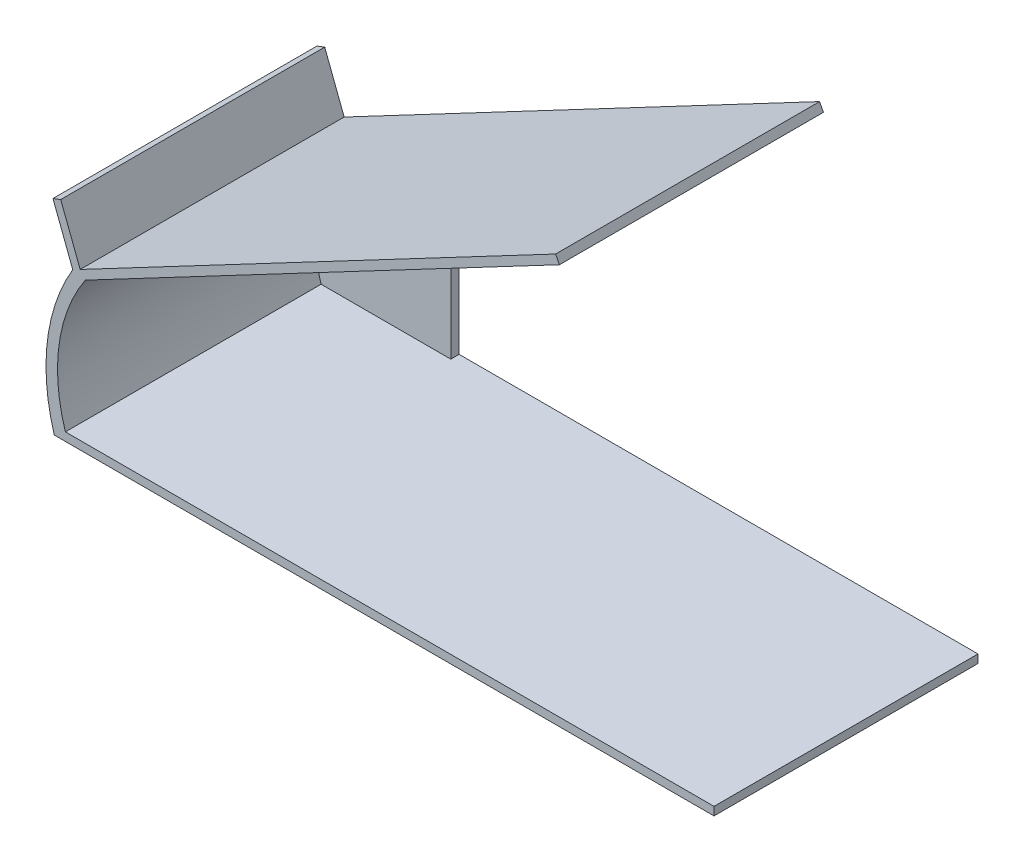
ISO-10303-21;
HEADER;
FILE_DESCRIPTION(('STEP AP214'),'2;1');
FILE_NAME('part.step','',(''),(''),'','','');
FILE_SCHEMA(('AUTOMOTIVE_DESIGN { 1 0 10303 214 1 1 1 1 }'));
ENDSEC;
DATA;
#1=APPLICATION_CONTEXT('core data for automotive mechanical design processes');
#2=APPLICATION_PROTOCOL_DEFINITION('international standard','automotive_design',2000,#1);
#3=PRODUCT_CONTEXT('',#1,'mechanical');
#4=PRODUCT('Part','Part','',(#3));
#5=PRODUCT_RELATED_PRODUCT_CATEGORY('part','',(#4));
#6=PRODUCT_DEFINITION_FORMATION('','',#4);
#7=PRODUCT_DEFINITION_CONTEXT('part definition',#1,'design');
#8=PRODUCT_DEFINITION('design','',#6,#7);
#9=PRODUCT_DEFINITION_SHAPE('','',#8);
#10=(LENGTH_UNIT() NAMED_UNIT(*) SI_UNIT(.MILLI.,.METRE.));
#11=(NAMED_UNIT(*) PLANE_ANGLE_UNIT() SI_UNIT($,.RADIAN.));
#12=(NAMED_UNIT(*) SI_UNIT($,.STERADIAN.) SOLID_ANGLE_UNIT());
#13=UNCERTAINTY_MEASURE_WITH_UNIT(LENGTH_MEASURE(1.E-05),#10,'distance_accuracy_value','');
#14=(GEOMETRIC_REPRESENTATION_CONTEXT(3) GLOBAL_UNCERTAINTY_ASSIGNED_CONTEXT((#13)) GLOBAL_UNIT_ASSIGNED_CONTEXT((#10,
#11,#12)) REPRESENTATION_CONTEXT('',''));
#15=CARTESIAN_POINT('',(0.,0.,0.));
#16=DIRECTION('',(0.,0.,1.));
#17=DIRECTION('',(1.,0.,0.));
#18=AXIS2_PLACEMENT_3D('',#15,#16,#17);
#19=CARTESIAN_POINT('',(63.1559092782897,21.097343814176,95.25));
#20=DIRECTION('',(0.,0.,-1.));
#21=DIRECTION('',(-1.,0.,0.));
#22=AXIS2_PLACEMENT_3D('',#19,#20,#21);
#23=CYLINDRICAL_SURFACE('',#22,59.);
#24=CARTESIAN_POINT('',(63.1559092782897,21.097343814176,3.));
#25=DIRECTION('',(0.,0.,-1.));
#26=DIRECTION('',(-1.,0.,0.));
#27=AXIS2_PLACEMENT_3D('',#24,#25,#26);
#28=CIRCLE('',#27,59.);
#29=CARTESIAN_POINT('',(14.1822917284551,54.,3.));
#30=VERTEX_POINT('',#29);
#31=CARTESIAN_POINT('',(6.99999999999996,2.99999999999997,3.));
#32=VERTEX_POINT('',#31);
#33=EDGE_CURVE('E184',#30,#32,#28,.F.);
#34=ORIENTED_EDGE('',*,*,#33,.F.);
#35=DIRECTION('',(0.,0.,-1.));
#36=VECTOR('',#35,1.);
#37=CARTESIAN_POINT('',(14.1822917284551,54.,95.25));
#38=LINE('',#37,#36);
#39=CARTESIAN_POINT('',(14.1822917284551,54.,95.25));
#40=VERTEX_POINT('',#39);
#41=EDGE_CURVE('E232',#40,#30,#38,.T.);
#42=ORIENTED_EDGE('',*,*,#41,.F.);
#43=CARTESIAN_POINT('',(63.1559092782897,21.097343814176,95.25));
#44=DIRECTION('',(0.,0.,-1.));
#45=DIRECTION('',(1.,0.,0.));
#46=AXIS2_PLACEMENT_3D('',#43,#44,#45);
#47=CIRCLE('',#46,59.);
#48=CARTESIAN_POINT('',(6.99999999999996,2.99999999999997,95.25));
#49=VERTEX_POINT('',#48);
#50=EDGE_CURVE('E196',#49,#40,#47,.T.);
#51=ORIENTED_EDGE('',*,*,#50,.F.);
#52=DIRECTION('',(0.,0.,-1.));
#53=VECTOR('',#52,1.);
#54=CARTESIAN_POINT('',(6.99999999999996,2.99999999999997,95.25));
#55=LINE('',#54,#53);
#56=EDGE_CURVE('E47',#49,#32,#55,.T.);
#57=ORIENTED_EDGE('',*,*,#56,.T.);
#58=EDGE_LOOP('',(#34,#42,#51,#57));
#59=FACE_BOUND('',#58,.T.);
#60=ADVANCED_FACE('F39',(#59),#23,.F.);
#61=CARTESIAN_POINT('',(241.,0.,95.25));
#62=DIRECTION('',(-1.,0.,0.));
#63=DIRECTION('',(0.,0.,1.));
#64=AXIS2_PLACEMENT_3D('',#61,#62,#63);
#65=PLANE('',#64);
#66=DIRECTION('',(0.,1.,0.));
#67=VECTOR('',#66,1.);
#68=CARTESIAN_POINT('',(241.,0.,0.));
#69=LINE('',#68,#67);
#70=CARTESIAN_POINT('',(241.,0.,0.));
#71=VERTEX_POINT('',#70);
#72=CARTESIAN_POINT('',(241.,3.,0.));
#73=VERTEX_POINT('',#72);
#74=EDGE_CURVE('E190',#71,#73,#69,.T.);
#75=ORIENTED_EDGE('',*,*,#74,.T.);
#76=DIRECTION('',(0.,0.,-1.));
#77=VECTOR('',#76,1.);
#78=CARTESIAN_POINT('',(241.,3.,95.25));
#79=LINE('',#78,#77);
#80=CARTESIAN_POINT('',(241.,3.,95.25));
#81=VERTEX_POINT('',#80);
#82=EDGE_CURVE('E11',#81,#73,#79,.T.);
#83=ORIENTED_EDGE('',*,*,#82,.F.);
#84=DIRECTION('',(0.,1.,0.));
#85=VECTOR('',#84,1.);
#86=CARTESIAN_POINT('',(241.,0.,95.25));
#87=LINE('',#86,#85);
#88=CARTESIAN_POINT('',(241.,0.,95.25));
#89=VERTEX_POINT('',#88);
#90=EDGE_CURVE('E191',#89,#81,#87,.T.);
#91=ORIENTED_EDGE('',*,*,#90,.F.);
#92=DIRECTION('',(0.,0.,-1.));
#93=VECTOR('',#92,1.);
#94=CARTESIAN_POINT('',(241.,0.,95.25));
#95=LINE('',#94,#93);
#96=EDGE_CURVE('E208',#89,#71,#95,.T.);
#97=ORIENTED_EDGE('',*,*,#96,.T.);
#98=EDGE_LOOP('',(#75,#83,#91,#97));
#99=FACE_BOUND('',#98,.T.);
#100=ADVANCED_FACE('F41',(#99),#65,.F.);
#101=CARTESIAN_POINT('',(241.,3.,95.25));
#102=DIRECTION('',(0.,-1.,0.));
#103=DIRECTION('',(1.,0.,0.));
#104=AXIS2_PLACEMENT_3D('',#101,#102,#103);
#105=PLANE('',#104);
#106=DIRECTION('',(-1.,0.,0.));
#107=VECTOR('',#106,1.);
#108=CARTESIAN_POINT('',(241.,3.,0.));
#109=LINE('',#108,#107);
#110=CARTESIAN_POINT('',(53.8,2.99999999999998,0.));
#111=VERTEX_POINT('',#110);
#112=EDGE_CURVE('E211',#73,#111,#109,.T.);
#113=ORIENTED_EDGE('',*,*,#112,.T.);
#114=DIRECTION('',(0.,0.,1.));
#115=VECTOR('',#114,1.);
#116=CARTESIAN_POINT('',(53.8,2.99999999999998,95.25));
#117=LINE('',#116,#115);
#118=CARTESIAN_POINT('',(53.8,2.99999999999998,3.));
#119=VERTEX_POINT('',#118);
#120=EDGE_CURVE('E179',#111,#119,#117,.T.);
#121=ORIENTED_EDGE('',*,*,#120,.T.);
#122=DIRECTION('',(1.,0.,0.));
#123=VECTOR('',#122,1.);
#124=CARTESIAN_POINT('',(241.,3.,3.));
#125=LINE('',#124,#123);
#126=EDGE_CURVE('E187',#32,#119,#125,.T.);
#127=ORIENTED_EDGE('',*,*,#126,.F.);
#128=ORIENTED_EDGE('',*,*,#56,.F.);
#129=DIRECTION('',(-1.,0.,0.));
#130=VECTOR('',#129,1.);
#131=CARTESIAN_POINT('',(241.,3.,95.25));
#132=LINE('',#131,#130);
#133=EDGE_CURVE('E193',#81,#49,#132,.T.);
#134=ORIENTED_EDGE('',*,*,#133,.F.);
#135=ORIENTED_EDGE('',*,*,#82,.T.);
#136=EDGE_LOOP('',(#113,#121,#127,#128,#134,#135));
#137=FACE_BOUND('',#136,.T.);
#138=ADVANCED_FACE('F262',(#137),#105,.F.);
#139=CARTESIAN_POINT('',(14.1822917284551,54.,95.25));
#140=DIRECTION('',(-0.467005076142132,0.884254634625955,0.));
#141=DIRECTION('',(-0.884254634625955,-0.467005076142132,0.));
#142=AXIS2_PLACEMENT_3D('',#139,#140,#141);
#143=PLANE('',#142);
#144=DIRECTION('',(-0.884254634625955,-0.467005076142132,0.));
#145=VECTOR('',#144,1.);
#146=CARTESIAN_POINT('',(14.1822917284551,54.,3.));
#147=LINE('',#146,#145);
#148=CARTESIAN_POINT('',(53.8,74.92346496522,3.));
#149=VERTEX_POINT('',#148);
#150=EDGE_CURVE('E181',#149,#30,#147,.T.);
#151=ORIENTED_EDGE('',*,*,#150,.F.);
#152=DIRECTION('',(0.,0.,-1.));
#153=VECTOR('',#152,1.);
#154=CARTESIAN_POINT('',(53.8,74.92346496522,95.25));
#155=LINE('',#154,#153);
#156=CARTESIAN_POINT('',(53.8,74.92346496522,0.));
#157=VERTEX_POINT('',#156);
#158=EDGE_CURVE('E174',#149,#157,#155,.T.);
#159=ORIENTED_EDGE('',*,*,#158,.T.);
#160=DIRECTION('',(0.884254634625955,0.467005076142132,0.));
#161=VECTOR('',#160,1.);
#162=CARTESIAN_POINT('',(14.1822917284551,54.,0.));
#163=LINE('',#162,#161);
#164=CARTESIAN_POINT('',(185.251015228426,144.347236096122,0.));
#165=VERTEX_POINT('',#164);
#166=EDGE_CURVE('E213',#157,#165,#163,.T.);
#167=ORIENTED_EDGE('',*,*,#166,.T.);
#168=DIRECTION('',(0.,0.,-1.));
#169=VECTOR('',#168,1.);
#170=CARTESIAN_POINT('',(185.251015228426,144.347236096122,95.25));
#171=LINE('',#170,#169);
#172=CARTESIAN_POINT('',(185.251015228426,144.347236096122,95.25));
#173=VERTEX_POINT('',#172);
#174=EDGE_CURVE('E229',#173,#165,#171,.T.);
#175=ORIENTED_EDGE('',*,*,#174,.F.);
#176=DIRECTION('',(0.884254634625955,0.467005076142132,0.));
#177=VECTOR('',#176,1.);
#178=CARTESIAN_POINT('',(14.1822917284551,54.,95.25));
#179=LINE('',#178,#177);
#180=EDGE_CURVE('E198',#40,#173,#179,.T.);
#181=ORIENTED_EDGE('',*,*,#180,.F.);
#182=ORIENTED_EDGE('',*,*,#41,.T.);
#183=EDGE_LOOP('',(#151,#159,#167,#175,#181,#182));
#184=FACE_BOUND('',#183,.T.);
#185=ADVANCED_FACE('F245',(#184),#143,.F.);
#186=CARTESIAN_POINT('',(185.251015228426,144.347236096122,95.25));
#187=DIRECTION('',(-0.884254634625957,-0.467005076142128,0.));
#188=DIRECTION('',(0.467005076142128,-0.884254634625957,0.));
#189=AXIS2_PLACEMENT_3D('',#186,#187,#188);
#190=PLANE('',#189);
#191=DIRECTION('',(-0.467005076142128,0.884254634625957,0.));
#192=VECTOR('',#191,1.);
#193=CARTESIAN_POINT('',(185.251015228426,144.347236096122,0.));
#194=LINE('',#193,#192);
#195=CARTESIAN_POINT('',(183.85,147.,0.));
#196=VERTEX_POINT('',#195);
#197=EDGE_CURVE('E215',#165,#196,#194,.T.);
#198=ORIENTED_EDGE('',*,*,#197,.T.);
#199=DIRECTION('',(0.,0.,-1.));
#200=VECTOR('',#199,1.);
#201=CARTESIAN_POINT('',(183.85,147.,95.25));
#202=LINE('',#201,#200);
#203=CARTESIAN_POINT('',(183.85,147.,95.25));
#204=VERTEX_POINT('',#203);
#205=EDGE_CURVE('E227',#204,#196,#202,.T.);
#206=ORIENTED_EDGE('',*,*,#205,.F.);
#207=DIRECTION('',(-0.467005076142128,0.884254634625957,0.));
#208=VECTOR('',#207,1.);
#209=CARTESIAN_POINT('',(185.251015228426,144.347236096122,95.25));
#210=LINE('',#209,#208);
#211=EDGE_CURVE('E200',#173,#204,#210,.T.);
#212=ORIENTED_EDGE('',*,*,#211,.F.);
#213=ORIENTED_EDGE('',*,*,#174,.T.);
#214=EDGE_LOOP('',(#198,#206,#212,#213));
#215=FACE_BOUND('',#214,.T.);
#216=ADVANCED_FACE('F258',(#215),#190,.F.);
#217=CARTESIAN_POINT('',(183.85,147.,95.25));
#218=DIRECTION('',(0.467005076142132,-0.884254634625955,0.));
#219=DIRECTION('',(0.884254634625955,0.467005076142132,0.));
#220=AXIS2_PLACEMENT_3D('',#217,#218,#219);
#221=PLANE('',#220);
#222=DIRECTION('',(-0.884254634625955,-0.467005076142132,0.));
#223=VECTOR('',#222,1.);
#224=CARTESIAN_POINT('',(183.85,147.,0.));
#225=LINE('',#224,#223);
#226=CARTESIAN_POINT('',(12.3240092566219,56.4112654537003,0.));
#227=VERTEX_POINT('',#226);
#228=EDGE_CURVE('E59',#196,#227,#225,.T.);
#229=ORIENTED_EDGE('',*,*,#228,.T.);
#230=DIRECTION('',(0.,0.,-1.));
#231=VECTOR('',#230,1.);
#232=CARTESIAN_POINT('',(12.3240092566219,56.4112654537002,117.307010006582));
#233=LINE('',#232,#231);
#234=CARTESIAN_POINT('',(12.3240092566219,56.4112654537003,95.25));
#235=VERTEX_POINT('',#234);
#236=EDGE_CURVE('E54',#235,#227,#233,.T.);
#237=ORIENTED_EDGE('',*,*,#236,.F.);
#238=DIRECTION('',(-0.884254634625955,-0.467005076142132,0.));
#239=VECTOR('',#238,1.);
#240=CARTESIAN_POINT('',(183.85,147.,95.25));
#241=LINE('',#240,#239);
#242=EDGE_CURVE('E202',#204,#235,#241,.T.);
#243=ORIENTED_EDGE('',*,*,#242,.F.);
#244=ORIENTED_EDGE('',*,*,#205,.T.);
#245=EDGE_LOOP('',(#229,#237,#243,#244));
#246=FACE_BOUND('',#245,.T.);
#247=ADVANCED_FACE('F295',(#246),#221,.F.);
#248=CARTESIAN_POINT('',(68.2435435794382,20.0115282144225,95.25));
#249=DIRECTION('',(0.,0.,-1.));
#250=DIRECTION('',(-1.,0.,0.));
#251=AXIS2_PLACEMENT_3D('',#248,#249,#250);
#252=CYLINDRICAL_SURFACE('',#251,68.2435435794382);
#253=CARTESIAN_POINT('',(68.2435435794382,20.0115282144225,0.));
#254=DIRECTION('',(0.,0.,1.));
#255=DIRECTION('',(1.,0.,0.));
#256=AXIS2_PLACEMENT_3D('',#253,#254,#255);
#257=CIRCLE('',#256,68.2435435794382);
#258=CARTESIAN_POINT('',(9.65183697868681,55.,0.));
#259=VERTEX_POINT('',#258);
#260=CARTESIAN_POINT('',(3.,0.,0.));
#261=VERTEX_POINT('',#260);
#262=EDGE_CURVE('E218',#259,#261,#257,.T.);
#263=ORIENTED_EDGE('',*,*,#262,.T.);
#264=DIRECTION('',(0.,0.,-1.));
#265=VECTOR('',#264,1.);
#266=CARTESIAN_POINT('',(3.,0.,95.25));
#267=LINE('',#266,#265);
#268=CARTESIAN_POINT('',(3.,0.,95.25));
#269=VERTEX_POINT('',#268);
#270=EDGE_CURVE('E224',#269,#261,#267,.T.);
#271=ORIENTED_EDGE('',*,*,#270,.F.);
#272=CARTESIAN_POINT('',(68.2435435794382,20.0115282144225,95.25));
#273=DIRECTION('',(0.,0.,1.));
#274=DIRECTION('',(1.,0.,0.));
#275=AXIS2_PLACEMENT_3D('',#272,#273,#274);
#276=CIRCLE('',#275,68.2435435794382);
#277=CARTESIAN_POINT('',(9.65183697868681,55.,95.25));
#278=VERTEX_POINT('',#277);
#279=EDGE_CURVE('E204',#278,#269,#276,.T.);
#280=ORIENTED_EDGE('',*,*,#279,.F.);
#281=DIRECTION('',(0.,0.,-1.));
#282=VECTOR('',#281,1.);
#283=CARTESIAN_POINT('',(9.65183697868681,55.,95.25));
#284=LINE('',#283,#282);
#285=EDGE_CURVE('E158',#278,#259,#284,.T.);
#286=ORIENTED_EDGE('',*,*,#285,.T.);
#287=EDGE_LOOP('',(#263,#271,#280,#286));
#288=FACE_BOUND('',#287,.T.);
#289=ADVANCED_FACE('F271',(#288),#252,.T.);
#290=CARTESIAN_POINT('',(241.,0.,95.25));
#291=DIRECTION('',(0.,1.,0.));
#292=DIRECTION('',(0.,0.,1.));
#293=AXIS2_PLACEMENT_3D('',#290,#291,#292);
#294=PLANE('',#293);
#295=DIRECTION('',(1.,0.,0.));
#296=VECTOR('',#295,1.);
#297=CARTESIAN_POINT('',(241.,0.,0.));
#298=LINE('',#297,#296);
#299=EDGE_CURVE('E194',#261,#71,#298,.T.);
#300=ORIENTED_EDGE('',*,*,#299,.T.);
#301=ORIENTED_EDGE('',*,*,#96,.F.);
#302=DIRECTION('',(1.,0.,0.));
#303=VECTOR('',#302,1.);
#304=CARTESIAN_POINT('',(241.,0.,95.25));
#305=LINE('',#304,#303);
#306=EDGE_CURVE('E206',#269,#89,#305,.T.);
#307=ORIENTED_EDGE('',*,*,#306,.F.);
#308=ORIENTED_EDGE('',*,*,#270,.T.);
#309=EDGE_LOOP('',(#300,#301,#307,#308));
#310=FACE_BOUND('',#309,.T.);
#311=ADVANCED_FACE('F267',(#310),#294,.F.);
#312=CARTESIAN_POINT('',(63.1559092782897,21.097343814176,95.25));
#313=DIRECTION('',(0.,0.,1.));
#314=DIRECTION('',(1.,0.,0.));
#315=AXIS2_PLACEMENT_3D('',#312,#313,#314);
#316=PLANE('',#315);
#317=ORIENTED_EDGE('',*,*,#90,.T.);
#318=ORIENTED_EDGE('',*,*,#133,.T.);
#319=ORIENTED_EDGE('',*,*,#50,.T.);
#320=ORIENTED_EDGE('',*,*,#180,.T.);
#321=ORIENTED_EDGE('',*,*,#211,.T.);
#322=ORIENTED_EDGE('',*,*,#242,.T.);
#323=DIRECTION('',(0.357232003058482,-0.934015682946933,0.));
#324=VECTOR('',#323,1.);
#325=CARTESIAN_POINT('',(5.30924396635797,74.7520096681141,95.25));
#326=LINE('',#325,#324);
#327=CARTESIAN_POINT('',(5.30924396635797,74.7520096681141,95.25));
#328=VERTEX_POINT('',#327);
#329=EDGE_CURVE('E142',#328,#235,#326,.T.);
#330=ORIENTED_EDGE('',*,*,#329,.F.);
#331=DIRECTION('',(0.934015682946931,0.357232003058486,0.));
#332=VECTOR('',#331,1.);
#333=CARTESIAN_POINT('',(2.50719691751717,73.6803136589386,95.25));
#334=LINE('',#333,#332);
#335=CARTESIAN_POINT('',(2.50719691751717,73.6803136589386,95.25));
#336=VERTEX_POINT('',#335);
#337=EDGE_CURVE('E134',#336,#328,#334,.T.);
#338=ORIENTED_EDGE('',*,*,#337,.F.);
#339=DIRECTION('',(-0.357232003058482,0.934015682946932,0.));
#340=VECTOR('',#339,1.);
#341=CARTESIAN_POINT('',(9.65183697868681,55.,95.25));
#342=LINE('',#341,#340);
#343=EDGE_CURVE('E139',#278,#336,#342,.T.);
#344=ORIENTED_EDGE('',*,*,#343,.F.);
#345=ORIENTED_EDGE('',*,*,#279,.T.);
#346=ORIENTED_EDGE('',*,*,#306,.T.);
#347=EDGE_LOOP('',(#317,#318,#319,#320,#321,#322,#330,#338,#344,#345,#346));
#348=FACE_BOUND('',#347,.T.);
#349=ADVANCED_FACE('F137',(#348),#316,.T.);
#350=CARTESIAN_POINT('',(63.1559092782897,21.097343814176,0.));
#351=DIRECTION('',(0.,0.,1.));
#352=DIRECTION('',(1.,0.,0.));
#353=AXIS2_PLACEMENT_3D('',#350,#351,#352);
#354=PLANE('',#353);
#355=ORIENTED_EDGE('',*,*,#166,.F.);
#356=DIRECTION('',(0.,-1.,0.));
#357=VECTOR('',#356,1.);
#358=CARTESIAN_POINT('',(53.8,78.3161528658822,0.));
#359=LINE('',#358,#357);
#360=EDGE_CURVE('E169',#157,#111,#359,.T.);
#361=ORIENTED_EDGE('',*,*,#360,.T.);
#362=ORIENTED_EDGE('',*,*,#112,.F.);
#363=ORIENTED_EDGE('',*,*,#74,.F.);
#364=ORIENTED_EDGE('',*,*,#299,.F.);
#365=ORIENTED_EDGE('',*,*,#262,.F.);
#366=DIRECTION('',(-0.357232003058482,0.934015682946932,0.));
#367=VECTOR('',#366,1.);
#368=CARTESIAN_POINT('',(9.65183697868681,55.,0.));
#369=LINE('',#368,#367);
#370=CARTESIAN_POINT('',(2.50719691751717,73.6803136589386,0.));
#371=VERTEX_POINT('',#370);
#372=EDGE_CURVE('E165',#259,#371,#369,.T.);
#373=ORIENTED_EDGE('',*,*,#372,.T.);
#374=DIRECTION('',(0.934015682946931,0.357232003058486,0.));
#375=VECTOR('',#374,1.);
#376=CARTESIAN_POINT('',(2.50719691751717,73.6803136589386,0.));
#377=LINE('',#376,#375);
#378=CARTESIAN_POINT('',(5.30924396635797,74.7520096681141,0.));
#379=VERTEX_POINT('',#378);
#380=EDGE_CURVE('E151',#371,#379,#377,.T.);
#381=ORIENTED_EDGE('',*,*,#380,.T.);
#382=DIRECTION('',(0.357232003058482,-0.934015682946933,0.));
#383=VECTOR('',#382,1.);
#384=CARTESIAN_POINT('',(5.30924396635797,74.7520096681141,0.));
#385=LINE('',#384,#383);
#386=EDGE_CURVE('E159',#379,#227,#385,.T.);
#387=ORIENTED_EDGE('',*,*,#386,.T.);
#388=ORIENTED_EDGE('',*,*,#228,.F.);
#389=ORIENTED_EDGE('',*,*,#197,.F.);
#390=EDGE_LOOP('',(#355,#361,#362,#363,#364,#365,#373,#381,#387,#388,#389));
#391=FACE_BOUND('',#390,.T.);
#392=ADVANCED_FACE('F252',(#391),#354,.F.);
#393=CARTESIAN_POINT('',(68.2435435794382,20.0115282144225,3.));
#394=DIRECTION('',(0.,0.,-1.));
#395=DIRECTION('',(-1.,0.,0.));
#396=AXIS2_PLACEMENT_3D('',#393,#394,#395);
#397=PLANE('',#396);
#398=ORIENTED_EDGE('',*,*,#33,.T.);
#399=ORIENTED_EDGE('',*,*,#126,.T.);
#400=DIRECTION('',(0.,-1.,0.));
#401=VECTOR('',#400,1.);
#402=CARTESIAN_POINT('',(53.8,78.3161528658822,3.));
#403=LINE('',#402,#401);
#404=EDGE_CURVE('E171',#149,#119,#403,.T.);
#405=ORIENTED_EDGE('',*,*,#404,.F.);
#406=ORIENTED_EDGE('',*,*,#150,.T.);
#407=EDGE_LOOP('',(#398,#399,#405,#406));
#408=FACE_BOUND('',#407,.T.);
#409=ADVANCED_FACE('F241',(#408),#397,.F.);
#410=CARTESIAN_POINT('',(53.8,78.3161528658822,3.));
#411=DIRECTION('',(1.,0.,0.));
#412=DIRECTION('',(0.,1.,0.));
#413=AXIS2_PLACEMENT_3D('',#410,#411,#412);
#414=PLANE('',#413);
#415=ORIENTED_EDGE('',*,*,#120,.F.);
#416=ORIENTED_EDGE('',*,*,#360,.F.);
#417=ORIENTED_EDGE('',*,*,#158,.F.);
#418=ORIENTED_EDGE('',*,*,#404,.T.);
#419=EDGE_LOOP('',(#415,#416,#417,#418));
#420=FACE_BOUND('',#419,.T.);
#421=ADVANCED_FACE('F250',(#420),#414,.T.);
#422=CARTESIAN_POINT('',(9.65183697868681,55.,117.307010006582));
#423=DIRECTION('',(-0.934015682946932,-0.357232003058482,0.));
#424=DIRECTION('',(0.357232003058482,-0.934015682946932,0.));
#425=AXIS2_PLACEMENT_3D('',#422,#423,#424);
#426=PLANE('',#425);
#427=ORIENTED_EDGE('',*,*,#285,.F.);
#428=ORIENTED_EDGE('',*,*,#343,.T.);
#429=DIRECTION('',(0.,0.,-1.));
#430=VECTOR('',#429,1.);
#431=CARTESIAN_POINT('',(2.50719691751717,73.6803136589386,117.307010006582));
#432=LINE('',#431,#430);
#433=EDGE_CURVE('E146',#336,#371,#432,.T.);
#434=ORIENTED_EDGE('',*,*,#433,.T.);
#435=ORIENTED_EDGE('',*,*,#372,.F.);
#436=EDGE_LOOP('',(#427,#428,#434,#435));
#437=FACE_BOUND('',#436,.T.);
#438=ADVANCED_FACE('F156',(#437),#426,.T.);
#439=CARTESIAN_POINT('',(2.50719691751717,73.6803136589386,117.307010006582));
#440=DIRECTION('',(-0.357232003058486,0.934015682946931,0.));
#441=DIRECTION('',(-0.934015682946931,-0.357232003058486,0.));
#442=AXIS2_PLACEMENT_3D('',#439,#440,#441);
#443=PLANE('',#442);
#444=ORIENTED_EDGE('',*,*,#433,.F.);
#445=ORIENTED_EDGE('',*,*,#337,.T.);
#446=DIRECTION('',(0.,0.,-1.));
#447=VECTOR('',#446,1.);
#448=CARTESIAN_POINT('',(5.30924396635797,74.7520096681141,117.307010006582));
#449=LINE('',#448,#447);
#450=EDGE_CURVE('E145',#328,#379,#449,.T.);
#451=ORIENTED_EDGE('',*,*,#450,.T.);
#452=ORIENTED_EDGE('',*,*,#380,.F.);
#453=EDGE_LOOP('',(#444,#445,#451,#452));
#454=FACE_BOUND('',#453,.T.);
#455=ADVANCED_FACE('F149',(#454),#443,.T.);
#456=CARTESIAN_POINT('',(5.30924396635797,74.7520096681141,117.307010006582));
#457=DIRECTION('',(0.934015682946933,0.357232003058482,0.));
#458=DIRECTION('',(-0.357232003058482,0.934015682946933,0.));
#459=AXIS2_PLACEMENT_3D('',#456,#457,#458);
#460=PLANE('',#459);
#461=ORIENTED_EDGE('',*,*,#450,.F.);
#462=ORIENTED_EDGE('',*,*,#329,.T.);
#463=ORIENTED_EDGE('',*,*,#236,.T.);
#464=ORIENTED_EDGE('',*,*,#386,.F.);
#465=EDGE_LOOP('',(#461,#462,#463,#464));
#466=FACE_BOUND('',#465,.T.);
#467=ADVANCED_FACE('F274',(#466),#460,.T.);
#468=CLOSED_SHELL('',(#60,#100,#138,#185,#216,#247,#289,#311,#349,#392,#409,#421,#438,#455,#467));
#469=MANIFOLD_SOLID_BREP('B2',#468);
#470=ADVANCED_BREP_SHAPE_REPRESENTATION('',(#18,#469),#14);
#471=SHAPE_DEFINITION_REPRESENTATION(#9,#470);
ENDSEC;
END-ISO-10303-21;
